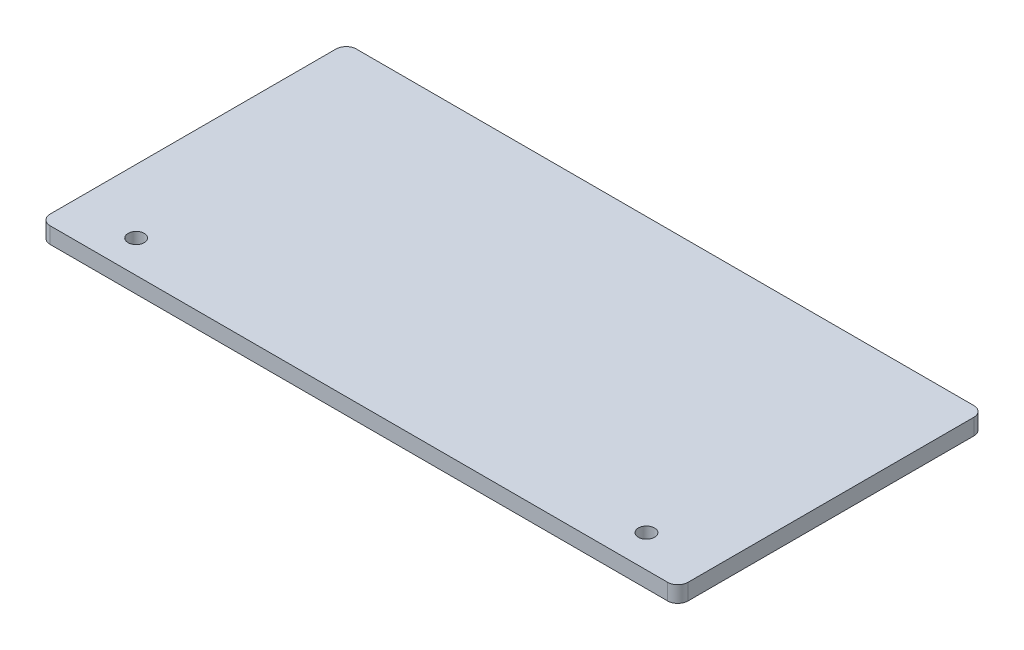
ISO-10303-21;
HEADER;
FILE_DESCRIPTION(('STEP AP214'),'2;1');
FILE_NAME('part.step','',(''),(''),'','','');
FILE_SCHEMA(('AUTOMOTIVE_DESIGN { 1 0 10303 214 1 1 1 1 }'));
ENDSEC;
DATA;
#1=APPLICATION_CONTEXT('core data for automotive mechanical design processes');
#2=APPLICATION_PROTOCOL_DEFINITION('international standard','automotive_design',2000,#1);
#3=PRODUCT_CONTEXT('',#1,'mechanical');
#4=PRODUCT('Part','Part','',(#3));
#5=PRODUCT_RELATED_PRODUCT_CATEGORY('part','',(#4));
#6=PRODUCT_DEFINITION_FORMATION('','',#4);
#7=PRODUCT_DEFINITION_CONTEXT('part definition',#1,'design');
#8=PRODUCT_DEFINITION('design','',#6,#7);
#9=PRODUCT_DEFINITION_SHAPE('','',#8);
#10=(LENGTH_UNIT() NAMED_UNIT(*) SI_UNIT(.MILLI.,.METRE.));
#11=(NAMED_UNIT(*) PLANE_ANGLE_UNIT() SI_UNIT($,.RADIAN.));
#12=(NAMED_UNIT(*) SI_UNIT($,.STERADIAN.) SOLID_ANGLE_UNIT());
#13=UNCERTAINTY_MEASURE_WITH_UNIT(LENGTH_MEASURE(1.E-05),#10,'distance_accuracy_value','');
#14=(GEOMETRIC_REPRESENTATION_CONTEXT(3) GLOBAL_UNCERTAINTY_ASSIGNED_CONTEXT((#13)) GLOBAL_UNIT_ASSIGNED_CONTEXT((#10,
#11,#12)) REPRESENTATION_CONTEXT('',''));
#15=CARTESIAN_POINT('',(0.,0.,0.));
#16=DIRECTION('',(0.,0.,1.));
#17=DIRECTION('',(1.,0.,0.));
#18=AXIS2_PLACEMENT_3D('',#15,#16,#17);
#19=CARTESIAN_POINT('',(-60.5,3.175,58.));
#20=DIRECTION('',(0.,1.,0.));
#21=DIRECTION('',(0.,0.,1.));
#22=AXIS2_PLACEMENT_3D('',#19,#20,#21);
#23=PLANE('',#22);
#24=CARTESIAN_POINT('',(-50.,3.175,53.65));
#25=DIRECTION('',(0.,1.,0.));
#26=DIRECTION('',(0.,0.,1.));
#27=AXIS2_PLACEMENT_3D('',#24,#25,#26);
#28=CIRCLE('',#27,1.5875);
#29=CARTESIAN_POINT('',(-50.,3.175,55.2375));
#30=VERTEX_POINT('',#29);
#31=EDGE_CURVE('E133',#30,#30,#28,.T.);
#32=ORIENTED_EDGE('',*,*,#31,.F.);
#33=EDGE_LOOP('',(#32));
#34=FACE_BOUND('',#33,.T.);
#35=CARTESIAN_POINT('',(-60.5,3.175,58.));
#36=DIRECTION('',(0.,1.,0.));
#37=DIRECTION('',(0.,0.,1.));
#38=AXIS2_PLACEMENT_3D('',#35,#36,#37);
#39=CIRCLE('',#38,2.);
#40=CARTESIAN_POINT('',(-62.5,3.175,58.));
#41=VERTEX_POINT('',#40);
#42=CARTESIAN_POINT('',(-60.5,3.175,60.));
#43=VERTEX_POINT('',#42);
#44=EDGE_CURVE('E144',#41,#43,#39,.T.);
#45=ORIENTED_EDGE('',*,*,#44,.T.);
#46=DIRECTION('',(1.,0.,0.));
#47=VECTOR('',#46,1.);
#48=CARTESIAN_POINT('',(-60.5,3.175,60.));
#49=LINE('',#48,#47);
#50=CARTESIAN_POINT('',(60.5,3.175,60.));
#51=VERTEX_POINT('',#50);
#52=EDGE_CURVE('E92',#43,#51,#49,.T.);
#53=ORIENTED_EDGE('',*,*,#52,.T.);
#54=CARTESIAN_POINT('',(60.5,3.175,58.));
#55=DIRECTION('',(0.,1.,0.));
#56=DIRECTION('',(0.,0.,1.));
#57=AXIS2_PLACEMENT_3D('',#54,#55,#56);
#58=CIRCLE('',#57,2.);
#59=CARTESIAN_POINT('',(62.5,3.175,58.));
#60=VERTEX_POINT('',#59);
#61=EDGE_CURVE('E159',#51,#60,#58,.T.);
#62=ORIENTED_EDGE('',*,*,#61,.T.);
#63=DIRECTION('',(0.,0.,-1.));
#64=VECTOR('',#63,1.);
#65=CARTESIAN_POINT('',(62.5,3.175,2.));
#66=LINE('',#65,#64);
#67=CARTESIAN_POINT('',(62.5,3.175,2.));
#68=VERTEX_POINT('',#67);
#69=EDGE_CURVE('E172',#60,#68,#66,.T.);
#70=ORIENTED_EDGE('',*,*,#69,.T.);
#71=CARTESIAN_POINT('',(60.5,3.175,2.));
#72=DIRECTION('',(0.,1.,0.));
#73=DIRECTION('',(0.,0.,-1.));
#74=AXIS2_PLACEMENT_3D('',#71,#72,#73);
#75=CIRCLE('',#74,2.);
#76=CARTESIAN_POINT('',(60.5,3.175,0.));
#77=VERTEX_POINT('',#76);
#78=EDGE_CURVE('E111',#68,#77,#75,.T.);
#79=ORIENTED_EDGE('',*,*,#78,.T.);
#80=DIRECTION('',(-1.,0.,0.));
#81=VECTOR('',#80,1.);
#82=CARTESIAN_POINT('',(-60.5,3.175,0.));
#83=LINE('',#82,#81);
#84=CARTESIAN_POINT('',(-60.5,3.175,0.));
#85=VERTEX_POINT('',#84);
#86=EDGE_CURVE('E105',#77,#85,#83,.T.);
#87=ORIENTED_EDGE('',*,*,#86,.T.);
#88=CARTESIAN_POINT('',(-60.5,3.175,2.));
#89=DIRECTION('',(0.,1.,0.));
#90=DIRECTION('',(0.,0.,1.));
#91=AXIS2_PLACEMENT_3D('',#88,#89,#90);
#92=CIRCLE('',#91,2.);
#93=CARTESIAN_POINT('',(-62.5,3.175,2.));
#94=VERTEX_POINT('',#93);
#95=EDGE_CURVE('E109',#85,#94,#92,.T.);
#96=ORIENTED_EDGE('',*,*,#95,.T.);
#97=DIRECTION('',(0.,0.,1.));
#98=VECTOR('',#97,1.);
#99=CARTESIAN_POINT('',(-62.5,3.175,2.));
#100=LINE('',#99,#98);
#101=EDGE_CURVE('E49',#94,#41,#100,.T.);
#102=ORIENTED_EDGE('',*,*,#101,.T.);
#103=EDGE_LOOP('',(#45,#53,#62,#70,#79,#87,#96,#102));
#104=FACE_BOUND('',#103,.T.);
#105=CARTESIAN_POINT('',(50.,3.175,53.65));
#106=DIRECTION('',(0.,1.,0.));
#107=DIRECTION('',(0.,0.,1.));
#108=AXIS2_PLACEMENT_3D('',#105,#106,#107);
#109=CIRCLE('',#108,1.5875);
#110=CARTESIAN_POINT('',(50.,3.175,55.2375));
#111=VERTEX_POINT('',#110);
#112=EDGE_CURVE('E181',#111,#111,#109,.T.);
#113=ORIENTED_EDGE('',*,*,#112,.F.);
#114=EDGE_LOOP('',(#113));
#115=FACE_BOUND('',#114,.T.);
#116=ADVANCED_FACE('F32',(#34,#104,#115),#23,.T.);
#117=CARTESIAN_POINT('',(-60.5,0.,58.));
#118=DIRECTION('',(0.,1.,0.));
#119=DIRECTION('',(0.,0.,1.));
#120=AXIS2_PLACEMENT_3D('',#117,#118,#119);
#121=PLANE('',#120);
#122=CARTESIAN_POINT('',(-60.5,0.,58.));
#123=DIRECTION('',(0.,1.,0.));
#124=DIRECTION('',(0.,0.,1.));
#125=AXIS2_PLACEMENT_3D('',#122,#123,#124);
#126=CIRCLE('',#125,2.);
#127=CARTESIAN_POINT('',(-62.5,0.,58.));
#128=VERTEX_POINT('',#127);
#129=CARTESIAN_POINT('',(-60.5,0.,60.));
#130=VERTEX_POINT('',#129);
#131=EDGE_CURVE('E129',#128,#130,#126,.T.);
#132=ORIENTED_EDGE('',*,*,#131,.F.);
#133=DIRECTION('',(0.,0.,1.));
#134=VECTOR('',#133,1.);
#135=CARTESIAN_POINT('',(-62.5,0.,2.));
#136=LINE('',#135,#134);
#137=CARTESIAN_POINT('',(-62.5,0.,2.));
#138=VERTEX_POINT('',#137);
#139=EDGE_CURVE('E84',#138,#128,#136,.T.);
#140=ORIENTED_EDGE('',*,*,#139,.F.);
#141=CARTESIAN_POINT('',(-60.5,0.,2.));
#142=DIRECTION('',(0.,1.,0.));
#143=DIRECTION('',(0.,0.,1.));
#144=AXIS2_PLACEMENT_3D('',#141,#142,#143);
#145=CIRCLE('',#144,2.);
#146=CARTESIAN_POINT('',(-60.5,0.,0.));
#147=VERTEX_POINT('',#146);
#148=EDGE_CURVE('E78',#147,#138,#145,.T.);
#149=ORIENTED_EDGE('',*,*,#148,.F.);
#150=DIRECTION('',(-1.,0.,0.));
#151=VECTOR('',#150,1.);
#152=CARTESIAN_POINT('',(-60.5,0.,0.));
#153=LINE('',#152,#151);
#154=CARTESIAN_POINT('',(60.5,0.,0.));
#155=VERTEX_POINT('',#154);
#156=EDGE_CURVE('E119',#155,#147,#153,.T.);
#157=ORIENTED_EDGE('',*,*,#156,.F.);
#158=CARTESIAN_POINT('',(60.5,0.,2.));
#159=DIRECTION('',(0.,1.,0.));
#160=DIRECTION('',(0.,0.,-1.));
#161=AXIS2_PLACEMENT_3D('',#158,#159,#160);
#162=CIRCLE('',#161,2.);
#163=CARTESIAN_POINT('',(62.5,0.,2.));
#164=VERTEX_POINT('',#163);
#165=EDGE_CURVE('E139',#164,#155,#162,.T.);
#166=ORIENTED_EDGE('',*,*,#165,.F.);
#167=DIRECTION('',(0.,0.,-1.));
#168=VECTOR('',#167,1.);
#169=CARTESIAN_POINT('',(62.5,0.,2.));
#170=LINE('',#169,#168);
#171=CARTESIAN_POINT('',(62.5,0.,58.));
#172=VERTEX_POINT('',#171);
#173=EDGE_CURVE('E137',#172,#164,#170,.T.);
#174=ORIENTED_EDGE('',*,*,#173,.F.);
#175=CARTESIAN_POINT('',(60.5,0.,58.));
#176=DIRECTION('',(0.,1.,0.));
#177=DIRECTION('',(0.,0.,1.));
#178=AXIS2_PLACEMENT_3D('',#175,#176,#177);
#179=CIRCLE('',#178,2.);
#180=CARTESIAN_POINT('',(60.5,0.,60.));
#181=VERTEX_POINT('',#180);
#182=EDGE_CURVE('E135',#181,#172,#179,.T.);
#183=ORIENTED_EDGE('',*,*,#182,.F.);
#184=DIRECTION('',(1.,0.,0.));
#185=VECTOR('',#184,1.);
#186=CARTESIAN_POINT('',(-60.5,0.,60.));
#187=LINE('',#186,#185);
#188=EDGE_CURVE('E132',#130,#181,#187,.T.);
#189=ORIENTED_EDGE('',*,*,#188,.F.);
#190=EDGE_LOOP('',(#132,#140,#149,#157,#166,#174,#183,#189));
#191=FACE_BOUND('',#190,.T.);
#192=CARTESIAN_POINT('',(-50.,0.,53.65));
#193=DIRECTION('',(0.,1.,0.));
#194=DIRECTION('',(0.,0.,1.));
#195=AXIS2_PLACEMENT_3D('',#192,#193,#194);
#196=CIRCLE('',#195,1.5875);
#197=CARTESIAN_POINT('',(-50.,0.,55.2375));
#198=VERTEX_POINT('',#197);
#199=EDGE_CURVE('E178',#198,#198,#196,.T.);
#200=ORIENTED_EDGE('',*,*,#199,.T.);
#201=EDGE_LOOP('',(#200));
#202=FACE_BOUND('',#201,.T.);
#203=CARTESIAN_POINT('',(50.,0.,53.65));
#204=DIRECTION('',(0.,1.,0.));
#205=DIRECTION('',(0.,0.,1.));
#206=AXIS2_PLACEMENT_3D('',#203,#204,#205);
#207=CIRCLE('',#206,1.5875);
#208=CARTESIAN_POINT('',(50.,0.,55.2375));
#209=VERTEX_POINT('',#208);
#210=EDGE_CURVE('E184',#209,#209,#207,.T.);
#211=ORIENTED_EDGE('',*,*,#210,.T.);
#212=EDGE_LOOP('',(#211));
#213=FACE_BOUND('',#212,.T.);
#214=ADVANCED_FACE('F163',(#191,#202,#213),#121,.F.);
#215=CARTESIAN_POINT('',(-60.5,3.175,58.));
#216=DIRECTION('',(0.,-1.,0.));
#217=DIRECTION('',(0.,0.,-1.));
#218=AXIS2_PLACEMENT_3D('',#215,#216,#217);
#219=CYLINDRICAL_SURFACE('',#218,2.);
#220=ORIENTED_EDGE('',*,*,#131,.T.);
#221=DIRECTION('',(0.,-1.,0.));
#222=VECTOR('',#221,1.);
#223=CARTESIAN_POINT('',(-60.5,3.175,60.));
#224=LINE('',#223,#222);
#225=EDGE_CURVE('E11',#43,#130,#224,.T.);
#226=ORIENTED_EDGE('',*,*,#225,.F.);
#227=ORIENTED_EDGE('',*,*,#44,.F.);
#228=DIRECTION('',(0.,-1.,0.));
#229=VECTOR('',#228,1.);
#230=CARTESIAN_POINT('',(-62.5,3.175,58.));
#231=LINE('',#230,#229);
#232=EDGE_CURVE('E125',#41,#128,#231,.T.);
#233=ORIENTED_EDGE('',*,*,#232,.T.);
#234=EDGE_LOOP('',(#220,#226,#227,#233));
#235=FACE_BOUND('',#234,.T.);
#236=ADVANCED_FACE('F34',(#235),#219,.T.);
#237=CARTESIAN_POINT('',(-60.5,3.175,60.));
#238=DIRECTION('',(0.,0.,-1.));
#239=DIRECTION('',(-1.,0.,0.));
#240=AXIS2_PLACEMENT_3D('',#237,#238,#239);
#241=PLANE('',#240);
#242=ORIENTED_EDGE('',*,*,#188,.T.);
#243=DIRECTION('',(0.,-1.,0.));
#244=VECTOR('',#243,1.);
#245=CARTESIAN_POINT('',(60.5,3.175,60.));
#246=LINE('',#245,#244);
#247=EDGE_CURVE('E41',#51,#181,#246,.T.);
#248=ORIENTED_EDGE('',*,*,#247,.F.);
#249=ORIENTED_EDGE('',*,*,#52,.F.);
#250=ORIENTED_EDGE('',*,*,#225,.T.);
#251=EDGE_LOOP('',(#242,#248,#249,#250));
#252=FACE_BOUND('',#251,.T.);
#253=ADVANCED_FACE('F216',(#252),#241,.F.);
#254=CARTESIAN_POINT('',(60.5,3.175,58.));
#255=DIRECTION('',(0.,-1.,0.));
#256=DIRECTION('',(0.,0.,-1.));
#257=AXIS2_PLACEMENT_3D('',#254,#255,#256);
#258=CYLINDRICAL_SURFACE('',#257,2.);
#259=ORIENTED_EDGE('',*,*,#182,.T.);
#260=DIRECTION('',(0.,-1.,0.));
#261=VECTOR('',#260,1.);
#262=CARTESIAN_POINT('',(62.5,3.175,58.));
#263=LINE('',#262,#261);
#264=EDGE_CURVE('E151',#60,#172,#263,.T.);
#265=ORIENTED_EDGE('',*,*,#264,.F.);
#266=ORIENTED_EDGE('',*,*,#61,.F.);
#267=ORIENTED_EDGE('',*,*,#247,.T.);
#268=EDGE_LOOP('',(#259,#265,#266,#267));
#269=FACE_BOUND('',#268,.T.);
#270=ADVANCED_FACE('F157',(#269),#258,.T.);
#271=CARTESIAN_POINT('',(62.5,3.175,2.));
#272=DIRECTION('',(-1.,0.,0.));
#273=DIRECTION('',(0.,0.,1.));
#274=AXIS2_PLACEMENT_3D('',#271,#272,#273);
#275=PLANE('',#274);
#276=ORIENTED_EDGE('',*,*,#173,.T.);
#277=DIRECTION('',(0.,-1.,0.));
#278=VECTOR('',#277,1.);
#279=CARTESIAN_POINT('',(62.5,3.175,2.));
#280=LINE('',#279,#278);
#281=EDGE_CURVE('E148',#68,#164,#280,.T.);
#282=ORIENTED_EDGE('',*,*,#281,.F.);
#283=ORIENTED_EDGE('',*,*,#69,.F.);
#284=ORIENTED_EDGE('',*,*,#264,.T.);
#285=EDGE_LOOP('',(#276,#282,#283,#284));
#286=FACE_BOUND('',#285,.T.);
#287=ADVANCED_FACE('F168',(#286),#275,.F.);
#288=CARTESIAN_POINT('',(60.5,3.175,2.));
#289=DIRECTION('',(0.,-1.,0.));
#290=DIRECTION('',(0.,0.,-1.));
#291=AXIS2_PLACEMENT_3D('',#288,#289,#290);
#292=CYLINDRICAL_SURFACE('',#291,2.);
#293=ORIENTED_EDGE('',*,*,#165,.T.);
#294=DIRECTION('',(0.,-1.,0.));
#295=VECTOR('',#294,1.);
#296=CARTESIAN_POINT('',(60.5,3.175,0.));
#297=LINE('',#296,#295);
#298=EDGE_CURVE('E120',#77,#155,#297,.T.);
#299=ORIENTED_EDGE('',*,*,#298,.F.);
#300=ORIENTED_EDGE('',*,*,#78,.F.);
#301=ORIENTED_EDGE('',*,*,#281,.T.);
#302=EDGE_LOOP('',(#293,#299,#300,#301));
#303=FACE_BOUND('',#302,.T.);
#304=ADVANCED_FACE('F171',(#303),#292,.T.);
#305=CARTESIAN_POINT('',(-60.5,3.175,0.));
#306=DIRECTION('',(0.,0.,1.));
#307=DIRECTION('',(1.,0.,0.));
#308=AXIS2_PLACEMENT_3D('',#305,#306,#307);
#309=PLANE('',#308);
#310=ORIENTED_EDGE('',*,*,#156,.T.);
#311=DIRECTION('',(0.,-1.,0.));
#312=VECTOR('',#311,1.);
#313=CARTESIAN_POINT('',(-60.5,3.175,0.));
#314=LINE('',#313,#312);
#315=EDGE_CURVE('E116',#85,#147,#314,.T.);
#316=ORIENTED_EDGE('',*,*,#315,.F.);
#317=ORIENTED_EDGE('',*,*,#86,.F.);
#318=ORIENTED_EDGE('',*,*,#298,.T.);
#319=EDGE_LOOP('',(#310,#316,#317,#318));
#320=FACE_BOUND('',#319,.T.);
#321=ADVANCED_FACE('F117',(#320),#309,.F.);
#322=CARTESIAN_POINT('',(-60.5,3.175,2.));
#323=DIRECTION('',(0.,-1.,0.));
#324=DIRECTION('',(0.,0.,-1.));
#325=AXIS2_PLACEMENT_3D('',#322,#323,#324);
#326=CYLINDRICAL_SURFACE('',#325,2.);
#327=ORIENTED_EDGE('',*,*,#148,.T.);
#328=DIRECTION('',(0.,-1.,0.));
#329=VECTOR('',#328,1.);
#330=CARTESIAN_POINT('',(-62.5,3.175,2.));
#331=LINE('',#330,#329);
#332=EDGE_CURVE('E121',#94,#138,#331,.T.);
#333=ORIENTED_EDGE('',*,*,#332,.F.);
#334=ORIENTED_EDGE('',*,*,#95,.F.);
#335=ORIENTED_EDGE('',*,*,#315,.T.);
#336=EDGE_LOOP('',(#327,#333,#334,#335));
#337=FACE_BOUND('',#336,.T.);
#338=ADVANCED_FACE('F123',(#337),#326,.T.);
#339=CARTESIAN_POINT('',(-62.5,3.175,2.));
#340=DIRECTION('',(1.,0.,0.));
#341=DIRECTION('',(0.,0.,-1.));
#342=AXIS2_PLACEMENT_3D('',#339,#340,#341);
#343=PLANE('',#342);
#344=ORIENTED_EDGE('',*,*,#139,.T.);
#345=ORIENTED_EDGE('',*,*,#232,.F.);
#346=ORIENTED_EDGE('',*,*,#101,.F.);
#347=ORIENTED_EDGE('',*,*,#332,.T.);
#348=EDGE_LOOP('',(#344,#345,#346,#347));
#349=FACE_BOUND('',#348,.T.);
#350=ADVANCED_FACE('F204',(#349),#343,.F.);
#351=CARTESIAN_POINT('',(-50.,3.175,53.65));
#352=DIRECTION('',(0.,-1.,0.));
#353=DIRECTION('',(0.,0.,-1.));
#354=AXIS2_PLACEMENT_3D('',#351,#352,#353);
#355=CYLINDRICAL_SURFACE('',#354,1.5875);
#356=ORIENTED_EDGE('',*,*,#31,.T.);
#357=EDGE_LOOP('',(#356));
#358=FACE_BOUND('',#357,.T.);
#359=ORIENTED_EDGE('',*,*,#199,.F.);
#360=EDGE_LOOP('',(#359));
#361=FACE_BOUND('',#360,.T.);
#362=ADVANCED_FACE('F201',(#358,#361),#355,.F.);
#363=CARTESIAN_POINT('',(50.,3.175,53.65));
#364=DIRECTION('',(0.,-1.,0.));
#365=DIRECTION('',(0.,0.,-1.));
#366=AXIS2_PLACEMENT_3D('',#363,#364,#365);
#367=CYLINDRICAL_SURFACE('',#366,1.5875);
#368=ORIENTED_EDGE('',*,*,#112,.T.);
#369=EDGE_LOOP('',(#368));
#370=FACE_BOUND('',#369,.T.);
#371=ORIENTED_EDGE('',*,*,#210,.F.);
#372=EDGE_LOOP('',(#371));
#373=FACE_BOUND('',#372,.T.);
#374=ADVANCED_FACE('F190',(#370,#373),#367,.F.);
#375=CLOSED_SHELL('',(#116,#214,#236,#253,#270,#287,#304,#321,#338,#350,#362,#374));
#376=MANIFOLD_SOLID_BREP('B2',#375);
#377=ADVANCED_BREP_SHAPE_REPRESENTATION('',(#18,#376),#14);
#378=SHAPE_DEFINITION_REPRESENTATION(#9,#377);
ENDSEC;
END-ISO-10303-21;
